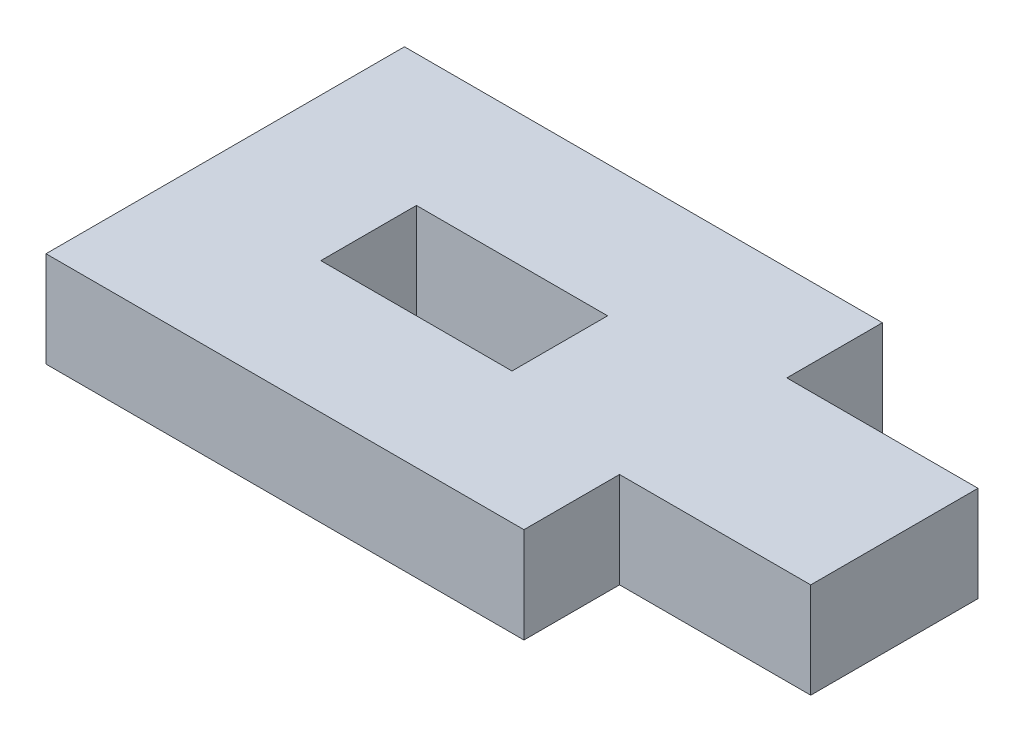
ISO-10303-21;
HEADER;
FILE_DESCRIPTION(('STEP AP214'),'2;1');
FILE_NAME('part.step','',(''),(''),'','','');
FILE_SCHEMA(('AUTOMOTIVE_DESIGN { 1 0 10303 214 1 1 1 1 }'));
ENDSEC;
DATA;
#1=APPLICATION_CONTEXT('core data for automotive mechanical design processes');
#2=APPLICATION_PROTOCOL_DEFINITION('international standard','automotive_design',2000,#1);
#3=PRODUCT_CONTEXT('',#1,'mechanical');
#4=PRODUCT('Part','Part','',(#3));
#5=PRODUCT_RELATED_PRODUCT_CATEGORY('part','',(#4));
#6=PRODUCT_DEFINITION_FORMATION('','',#4);
#7=PRODUCT_DEFINITION_CONTEXT('part definition',#1,'design');
#8=PRODUCT_DEFINITION('design','',#6,#7);
#9=PRODUCT_DEFINITION_SHAPE('','',#8);
#10=(LENGTH_UNIT() NAMED_UNIT(*) SI_UNIT(.MILLI.,.METRE.));
#11=(NAMED_UNIT(*) PLANE_ANGLE_UNIT() SI_UNIT($,.RADIAN.));
#12=(NAMED_UNIT(*) SI_UNIT($,.STERADIAN.) SOLID_ANGLE_UNIT());
#13=UNCERTAINTY_MEASURE_WITH_UNIT(LENGTH_MEASURE(1.E-05),#10,'distance_accuracy_value','');
#14=(GEOMETRIC_REPRESENTATION_CONTEXT(3) GLOBAL_UNCERTAINTY_ASSIGNED_CONTEXT((#13)) GLOBAL_UNIT_ASSIGNED_CONTEXT((#10,
#11,#12)) REPRESENTATION_CONTEXT('',''));
#15=CARTESIAN_POINT('',(0.,0.,0.));
#16=DIRECTION('',(0.,0.,1.));
#17=DIRECTION('',(1.,0.,0.));
#18=AXIS2_PLACEMENT_3D('',#15,#16,#17);
#19=CARTESIAN_POINT('',(10.,4.,-7.5));
#20=DIRECTION('',(-1.,0.,0.));
#21=DIRECTION('',(0.,0.,1.));
#22=AXIS2_PLACEMENT_3D('',#19,#20,#21);
#23=PLANE('',#22);
#24=DIRECTION('',(0.,-1.,0.));
#25=VECTOR('',#24,1.);
#26=CARTESIAN_POINT('',(10.,4.,3.5));
#27=LINE('',#26,#25);
#28=CARTESIAN_POINT('',(10.,4.,3.5));
#29=VERTEX_POINT('',#28);
#30=CARTESIAN_POINT('',(10.,0.,3.5));
#31=VERTEX_POINT('',#30);
#32=EDGE_CURVE('E127',#29,#31,#27,.T.);
#33=ORIENTED_EDGE('',*,*,#32,.F.);
#34=DIRECTION('',(0.,0.,-1.));
#35=VECTOR('',#34,1.);
#36=CARTESIAN_POINT('',(10.,4.,-7.5));
#37=LINE('',#36,#35);
#38=CARTESIAN_POINT('',(10.,4.,7.5));
#39=VERTEX_POINT('',#38);
#40=EDGE_CURVE('E139',#39,#29,#37,.T.);
#41=ORIENTED_EDGE('',*,*,#40,.F.);
#42=DIRECTION('',(0.,-1.,0.));
#43=VECTOR('',#42,1.);
#44=CARTESIAN_POINT('',(10.,4.,7.5));
#45=LINE('',#44,#43);
#46=CARTESIAN_POINT('',(10.,0.,7.5));
#47=VERTEX_POINT('',#46);
#48=EDGE_CURVE('E41',#39,#47,#45,.T.);
#49=ORIENTED_EDGE('',*,*,#48,.T.);
#50=DIRECTION('',(0.,0.,-1.));
#51=VECTOR('',#50,1.);
#52=CARTESIAN_POINT('',(10.,0.,-7.5));
#53=LINE('',#52,#51);
#54=EDGE_CURVE('E141',#47,#31,#53,.T.);
#55=ORIENTED_EDGE('',*,*,#54,.T.);
#56=EDGE_LOOP('',(#33,#41,#49,#55));
#57=FACE_BOUND('',#56,.T.);
#58=ADVANCED_FACE('F33',(#57),#23,.F.);
#59=CARTESIAN_POINT('',(0.,4.,0.));
#60=DIRECTION('',(0.,1.,0.));
#61=DIRECTION('',(0.,0.,1.));
#62=AXIS2_PLACEMENT_3D('',#59,#60,#61);
#63=PLANE('',#62);
#64=DIRECTION('',(0.,0.,1.));
#65=VECTOR('',#64,1.);
#66=CARTESIAN_POINT('',(-10.,4.,-7.5));
#67=LINE('',#66,#65);
#68=CARTESIAN_POINT('',(-10.,4.,-7.5));
#69=VERTEX_POINT('',#68);
#70=CARTESIAN_POINT('',(-10.,4.,7.5));
#71=VERTEX_POINT('',#70);
#72=EDGE_CURVE('E167',#69,#71,#67,.T.);
#73=ORIENTED_EDGE('',*,*,#72,.T.);
#74=DIRECTION('',(1.,0.,0.));
#75=VECTOR('',#74,1.);
#76=CARTESIAN_POINT('',(-10.,4.,7.5));
#77=LINE('',#76,#75);
#78=EDGE_CURVE('E147',#71,#39,#77,.T.);
#79=ORIENTED_EDGE('',*,*,#78,.T.);
#80=ORIENTED_EDGE('',*,*,#40,.T.);
#81=DIRECTION('',(1.,0.,0.));
#82=VECTOR('',#81,1.);
#83=CARTESIAN_POINT('',(18.,4.,3.5));
#84=LINE('',#83,#82);
#85=CARTESIAN_POINT('',(18.,4.,3.5));
#86=VERTEX_POINT('',#85);
#87=EDGE_CURVE('E124',#29,#86,#84,.T.);
#88=ORIENTED_EDGE('',*,*,#87,.T.);
#89=DIRECTION('',(0.,0.,-1.));
#90=VECTOR('',#89,1.);
#91=CARTESIAN_POINT('',(18.,4.,-3.5));
#92=LINE('',#91,#90);
#93=CARTESIAN_POINT('',(18.,4.,-3.5));
#94=VERTEX_POINT('',#93);
#95=EDGE_CURVE('E134',#86,#94,#92,.T.);
#96=ORIENTED_EDGE('',*,*,#95,.T.);
#97=DIRECTION('',(-1.,0.,0.));
#98=VECTOR('',#97,1.);
#99=CARTESIAN_POINT('',(10.,4.,-3.5));
#100=LINE('',#99,#98);
#101=CARTESIAN_POINT('',(10.,4.,-3.5));
#102=VERTEX_POINT('',#101);
#103=EDGE_CURVE('E183',#94,#102,#100,.T.);
#104=ORIENTED_EDGE('',*,*,#103,.T.);
#105=CARTESIAN_POINT('',(10.,4.,-7.5));
#106=VERTEX_POINT('',#105);
#107=EDGE_CURVE('E150',#102,#106,#37,.T.);
#108=ORIENTED_EDGE('',*,*,#107,.T.);
#109=DIRECTION('',(-1.,0.,0.));
#110=VECTOR('',#109,1.);
#111=CARTESIAN_POINT('',(-10.,4.,-7.5));
#112=LINE('',#111,#110);
#113=EDGE_CURVE('E149',#106,#69,#112,.T.);
#114=ORIENTED_EDGE('',*,*,#113,.T.);
#115=EDGE_LOOP('',(#73,#79,#80,#88,#96,#104,#108,#114));
#116=FACE_BOUND('',#115,.T.);
#117=DIRECTION('',(-1.,0.,0.));
#118=VECTOR('',#117,1.);
#119=CARTESIAN_POINT('',(4.,4.,-2.));
#120=LINE('',#119,#118);
#121=CARTESIAN_POINT('',(4.,4.,-2.));
#122=VERTEX_POINT('',#121);
#123=CARTESIAN_POINT('',(-4.,4.,-2.));
#124=VERTEX_POINT('',#123);
#125=EDGE_CURVE('E194',#122,#124,#120,.T.);
#126=ORIENTED_EDGE('',*,*,#125,.F.);
#127=DIRECTION('',(0.,0.,-1.));
#128=VECTOR('',#127,1.);
#129=CARTESIAN_POINT('',(4.,4.,2.));
#130=LINE('',#129,#128);
#131=CARTESIAN_POINT('',(4.,4.,2.));
#132=VERTEX_POINT('',#131);
#133=EDGE_CURVE('E192',#132,#122,#130,.T.);
#134=ORIENTED_EDGE('',*,*,#133,.F.);
#135=DIRECTION('',(1.,0.,0.));
#136=VECTOR('',#135,1.);
#137=CARTESIAN_POINT('',(4.,4.,2.));
#138=LINE('',#137,#136);
#139=CARTESIAN_POINT('',(-4.,4.,2.));
#140=VERTEX_POINT('',#139);
#141=EDGE_CURVE('E199',#140,#132,#138,.T.);
#142=ORIENTED_EDGE('',*,*,#141,.F.);
#143=DIRECTION('',(0.,0.,1.));
#144=VECTOR('',#143,1.);
#145=CARTESIAN_POINT('',(-4.,4.,2.));
#146=LINE('',#145,#144);
#147=EDGE_CURVE('E197',#124,#140,#146,.T.);
#148=ORIENTED_EDGE('',*,*,#147,.F.);
#149=EDGE_LOOP('',(#126,#134,#142,#148));
#150=FACE_BOUND('',#149,.T.);
#151=ADVANCED_FACE('F145',(#116,#150),#63,.T.);
#152=CARTESIAN_POINT('',(0.,0.,0.));
#153=DIRECTION('',(0.,1.,0.));
#154=DIRECTION('',(0.,0.,1.));
#155=AXIS2_PLACEMENT_3D('',#152,#153,#154);
#156=PLANE('',#155);
#157=DIRECTION('',(0.,0.,1.));
#158=VECTOR('',#157,1.);
#159=CARTESIAN_POINT('',(-10.,0.,-7.5));
#160=LINE('',#159,#158);
#161=CARTESIAN_POINT('',(-10.,0.,-7.5));
#162=VERTEX_POINT('',#161);
#163=CARTESIAN_POINT('',(-10.,0.,7.5));
#164=VERTEX_POINT('',#163);
#165=EDGE_CURVE('E157',#162,#164,#160,.T.);
#166=ORIENTED_EDGE('',*,*,#165,.F.);
#167=DIRECTION('',(-1.,0.,0.));
#168=VECTOR('',#167,1.);
#169=CARTESIAN_POINT('',(-10.,0.,-7.5));
#170=LINE('',#169,#168);
#171=CARTESIAN_POINT('',(10.,0.,-7.5));
#172=VERTEX_POINT('',#171);
#173=EDGE_CURVE('E165',#172,#162,#170,.T.);
#174=ORIENTED_EDGE('',*,*,#173,.F.);
#175=CARTESIAN_POINT('',(10.,0.,-3.5));
#176=VERTEX_POINT('',#175);
#177=EDGE_CURVE('E163',#176,#172,#53,.T.);
#178=ORIENTED_EDGE('',*,*,#177,.F.);
#179=DIRECTION('',(-1.,0.,0.));
#180=VECTOR('',#179,1.);
#181=CARTESIAN_POINT('',(10.,0.,-3.5));
#182=LINE('',#181,#180);
#183=CARTESIAN_POINT('',(18.,0.,-3.5));
#184=VERTEX_POINT('',#183);
#185=EDGE_CURVE('E48',#184,#176,#182,.T.);
#186=ORIENTED_EDGE('',*,*,#185,.F.);
#187=DIRECTION('',(0.,0.,-1.));
#188=VECTOR('',#187,1.);
#189=CARTESIAN_POINT('',(18.,0.,-3.5));
#190=LINE('',#189,#188);
#191=CARTESIAN_POINT('',(18.,0.,3.5));
#192=VERTEX_POINT('',#191);
#193=EDGE_CURVE('E179',#192,#184,#190,.T.);
#194=ORIENTED_EDGE('',*,*,#193,.F.);
#195=DIRECTION('',(1.,0.,0.));
#196=VECTOR('',#195,1.);
#197=CARTESIAN_POINT('',(18.,0.,3.5));
#198=LINE('',#197,#196);
#199=EDGE_CURVE('E178',#31,#192,#198,.T.);
#200=ORIENTED_EDGE('',*,*,#199,.F.);
#201=ORIENTED_EDGE('',*,*,#54,.F.);
#202=DIRECTION('',(1.,0.,0.));
#203=VECTOR('',#202,1.);
#204=CARTESIAN_POINT('',(-10.,0.,7.5));
#205=LINE('',#204,#203);
#206=EDGE_CURVE('E160',#164,#47,#205,.T.);
#207=ORIENTED_EDGE('',*,*,#206,.F.);
#208=EDGE_LOOP('',(#166,#174,#178,#186,#194,#200,#201,#207));
#209=FACE_BOUND('',#208,.T.);
#210=DIRECTION('',(0.,0.,-1.));
#211=VECTOR('',#210,1.);
#212=CARTESIAN_POINT('',(4.,0.,2.));
#213=LINE('',#212,#211);
#214=CARTESIAN_POINT('',(4.,0.,2.));
#215=VERTEX_POINT('',#214);
#216=CARTESIAN_POINT('',(4.,0.,-2.));
#217=VERTEX_POINT('',#216);
#218=EDGE_CURVE('E142',#215,#217,#213,.T.);
#219=ORIENTED_EDGE('',*,*,#218,.T.);
#220=DIRECTION('',(-1.,0.,0.));
#221=VECTOR('',#220,1.);
#222=CARTESIAN_POINT('',(4.,0.,-2.));
#223=LINE('',#222,#221);
#224=CARTESIAN_POINT('',(-4.,0.,-2.));
#225=VERTEX_POINT('',#224);
#226=EDGE_CURVE('E204',#217,#225,#223,.T.);
#227=ORIENTED_EDGE('',*,*,#226,.T.);
#228=DIRECTION('',(0.,0.,1.));
#229=VECTOR('',#228,1.);
#230=CARTESIAN_POINT('',(-4.,0.,2.));
#231=LINE('',#230,#229);
#232=CARTESIAN_POINT('',(-4.,0.,2.));
#233=VERTEX_POINT('',#232);
#234=EDGE_CURVE('E207',#225,#233,#231,.T.);
#235=ORIENTED_EDGE('',*,*,#234,.T.);
#236=DIRECTION('',(1.,0.,0.));
#237=VECTOR('',#236,1.);
#238=CARTESIAN_POINT('',(4.,0.,2.));
#239=LINE('',#238,#237);
#240=EDGE_CURVE('E195',#233,#215,#239,.T.);
#241=ORIENTED_EDGE('',*,*,#240,.T.);
#242=EDGE_LOOP('',(#219,#227,#235,#241));
#243=FACE_BOUND('',#242,.T.);
#244=ADVANCED_FACE('F175',(#209,#243),#156,.F.);
#245=CARTESIAN_POINT('',(-10.,4.,-7.5));
#246=DIRECTION('',(1.,0.,0.));
#247=DIRECTION('',(0.,0.,-1.));
#248=AXIS2_PLACEMENT_3D('',#245,#246,#247);
#249=PLANE('',#248);
#250=ORIENTED_EDGE('',*,*,#165,.T.);
#251=DIRECTION('',(0.,-1.,0.));
#252=VECTOR('',#251,1.);
#253=CARTESIAN_POINT('',(-10.,4.,7.5));
#254=LINE('',#253,#252);
#255=EDGE_CURVE('E11',#71,#164,#254,.T.);
#256=ORIENTED_EDGE('',*,*,#255,.F.);
#257=ORIENTED_EDGE('',*,*,#72,.F.);
#258=DIRECTION('',(0.,-1.,0.));
#259=VECTOR('',#258,1.);
#260=CARTESIAN_POINT('',(-10.,4.,-7.5));
#261=LINE('',#260,#259);
#262=EDGE_CURVE('E152',#69,#162,#261,.T.);
#263=ORIENTED_EDGE('',*,*,#262,.T.);
#264=EDGE_LOOP('',(#250,#256,#257,#263));
#265=FACE_BOUND('',#264,.T.);
#266=ADVANCED_FACE('F35',(#265),#249,.F.);
#267=CARTESIAN_POINT('',(-10.,4.,7.5));
#268=DIRECTION('',(0.,0.,-1.));
#269=DIRECTION('',(-1.,0.,0.));
#270=AXIS2_PLACEMENT_3D('',#267,#268,#269);
#271=PLANE('',#270);
#272=ORIENTED_EDGE('',*,*,#206,.T.);
#273=ORIENTED_EDGE('',*,*,#48,.F.);
#274=ORIENTED_EDGE('',*,*,#78,.F.);
#275=ORIENTED_EDGE('',*,*,#255,.T.);
#276=EDGE_LOOP('',(#272,#273,#274,#275));
#277=FACE_BOUND('',#276,.T.);
#278=ADVANCED_FACE('F223',(#277),#271,.F.);
#279=ORIENTED_EDGE('',*,*,#107,.F.);
#280=DIRECTION('',(0.,-1.,0.));
#281=VECTOR('',#280,1.);
#282=CARTESIAN_POINT('',(10.,4.,-3.5));
#283=LINE('',#282,#281);
#284=EDGE_CURVE('E187',#102,#176,#283,.T.);
#285=ORIENTED_EDGE('',*,*,#284,.T.);
#286=ORIENTED_EDGE('',*,*,#177,.T.);
#287=DIRECTION('',(0.,-1.,0.));
#288=VECTOR('',#287,1.);
#289=CARTESIAN_POINT('',(10.,4.,-7.5));
#290=LINE('',#289,#288);
#291=EDGE_CURVE('E170',#106,#172,#290,.T.);
#292=ORIENTED_EDGE('',*,*,#291,.F.);
#293=EDGE_LOOP('',(#279,#285,#286,#292));
#294=FACE_BOUND('',#293,.T.);
#295=ADVANCED_FACE('F225',(#294),#23,.F.);
#296=CARTESIAN_POINT('',(-10.,4.,-7.5));
#297=DIRECTION('',(0.,0.,1.));
#298=DIRECTION('',(1.,0.,0.));
#299=AXIS2_PLACEMENT_3D('',#296,#297,#298);
#300=PLANE('',#299);
#301=ORIENTED_EDGE('',*,*,#173,.T.);
#302=ORIENTED_EDGE('',*,*,#262,.F.);
#303=ORIENTED_EDGE('',*,*,#113,.F.);
#304=ORIENTED_EDGE('',*,*,#291,.T.);
#305=EDGE_LOOP('',(#301,#302,#303,#304));
#306=FACE_BOUND('',#305,.T.);
#307=ADVANCED_FACE('F230',(#306),#300,.F.);
#308=CARTESIAN_POINT('',(4.,4.,2.));
#309=DIRECTION('',(-1.,0.,0.));
#310=DIRECTION('',(0.,0.,1.));
#311=AXIS2_PLACEMENT_3D('',#308,#309,#310);
#312=PLANE('',#311);
#313=ORIENTED_EDGE('',*,*,#218,.F.);
#314=DIRECTION('',(0.,-1.,0.));
#315=VECTOR('',#314,1.);
#316=CARTESIAN_POINT('',(4.,4.,2.));
#317=LINE('',#316,#315);
#318=EDGE_CURVE('E201',#132,#215,#317,.T.);
#319=ORIENTED_EDGE('',*,*,#318,.F.);
#320=ORIENTED_EDGE('',*,*,#133,.T.);
#321=DIRECTION('',(0.,-1.,0.));
#322=VECTOR('',#321,1.);
#323=CARTESIAN_POINT('',(4.,4.,-2.));
#324=LINE('',#323,#322);
#325=EDGE_CURVE('E161',#122,#217,#324,.T.);
#326=ORIENTED_EDGE('',*,*,#325,.T.);
#327=EDGE_LOOP('',(#313,#319,#320,#326));
#328=FACE_BOUND('',#327,.T.);
#329=ADVANCED_FACE('F241',(#328),#312,.T.);
#330=CARTESIAN_POINT('',(4.,4.,-2.));
#331=DIRECTION('',(0.,0.,1.));
#332=DIRECTION('',(1.,0.,0.));
#333=AXIS2_PLACEMENT_3D('',#330,#331,#332);
#334=PLANE('',#333);
#335=ORIENTED_EDGE('',*,*,#226,.F.);
#336=ORIENTED_EDGE('',*,*,#325,.F.);
#337=ORIENTED_EDGE('',*,*,#125,.T.);
#338=DIRECTION('',(0.,-1.,0.));
#339=VECTOR('',#338,1.);
#340=CARTESIAN_POINT('',(-4.,4.,-2.));
#341=LINE('',#340,#339);
#342=EDGE_CURVE('E215',#124,#225,#341,.T.);
#343=ORIENTED_EDGE('',*,*,#342,.T.);
#344=EDGE_LOOP('',(#335,#336,#337,#343));
#345=FACE_BOUND('',#344,.T.);
#346=ADVANCED_FACE('F247',(#345),#334,.T.);
#347=CARTESIAN_POINT('',(-4.,4.,2.));
#348=DIRECTION('',(1.,0.,0.));
#349=DIRECTION('',(0.,0.,-1.));
#350=AXIS2_PLACEMENT_3D('',#347,#348,#349);
#351=PLANE('',#350);
#352=ORIENTED_EDGE('',*,*,#234,.F.);
#353=ORIENTED_EDGE('',*,*,#342,.F.);
#354=ORIENTED_EDGE('',*,*,#147,.T.);
#355=DIRECTION('',(0.,-1.,0.));
#356=VECTOR('',#355,1.);
#357=CARTESIAN_POINT('',(-4.,4.,2.));
#358=LINE('',#357,#356);
#359=EDGE_CURVE('E56',#140,#233,#358,.T.);
#360=ORIENTED_EDGE('',*,*,#359,.T.);
#361=EDGE_LOOP('',(#352,#353,#354,#360));
#362=FACE_BOUND('',#361,.T.);
#363=ADVANCED_FACE('F251',(#362),#351,.T.);
#364=CARTESIAN_POINT('',(4.,4.,2.));
#365=DIRECTION('',(0.,0.,-1.));
#366=DIRECTION('',(-1.,0.,0.));
#367=AXIS2_PLACEMENT_3D('',#364,#365,#366);
#368=PLANE('',#367);
#369=ORIENTED_EDGE('',*,*,#240,.F.);
#370=ORIENTED_EDGE('',*,*,#359,.F.);
#371=ORIENTED_EDGE('',*,*,#141,.T.);
#372=ORIENTED_EDGE('',*,*,#318,.T.);
#373=EDGE_LOOP('',(#369,#370,#371,#372));
#374=FACE_BOUND('',#373,.T.);
#375=ADVANCED_FACE('F255',(#374),#368,.T.);
#376=CARTESIAN_POINT('',(18.,4.,3.5));
#377=DIRECTION('',(0.,0.,-1.));
#378=DIRECTION('',(-1.,0.,0.));
#379=AXIS2_PLACEMENT_3D('',#376,#377,#378);
#380=PLANE('',#379);
#381=ORIENTED_EDGE('',*,*,#199,.T.);
#382=DIRECTION('',(0.,-1.,0.));
#383=VECTOR('',#382,1.);
#384=CARTESIAN_POINT('',(18.,4.,3.5));
#385=LINE('',#384,#383);
#386=EDGE_CURVE('E130',#86,#192,#385,.T.);
#387=ORIENTED_EDGE('',*,*,#386,.F.);
#388=ORIENTED_EDGE('',*,*,#87,.F.);
#389=ORIENTED_EDGE('',*,*,#32,.T.);
#390=EDGE_LOOP('',(#381,#387,#388,#389));
#391=FACE_BOUND('',#390,.T.);
#392=ADVANCED_FACE('F126',(#391),#380,.F.);
#393=CARTESIAN_POINT('',(18.,4.,-3.5));
#394=DIRECTION('',(-1.,0.,0.));
#395=DIRECTION('',(0.,0.,1.));
#396=AXIS2_PLACEMENT_3D('',#393,#394,#395);
#397=PLANE('',#396);
#398=ORIENTED_EDGE('',*,*,#193,.T.);
#399=DIRECTION('',(0.,-1.,0.));
#400=VECTOR('',#399,1.);
#401=CARTESIAN_POINT('',(18.,4.,-3.5));
#402=LINE('',#401,#400);
#403=EDGE_CURVE('E189',#94,#184,#402,.T.);
#404=ORIENTED_EDGE('',*,*,#403,.F.);
#405=ORIENTED_EDGE('',*,*,#95,.F.);
#406=ORIENTED_EDGE('',*,*,#386,.T.);
#407=EDGE_LOOP('',(#398,#404,#405,#406));
#408=FACE_BOUND('',#407,.T.);
#409=ADVANCED_FACE('F261',(#408),#397,.F.);
#410=CARTESIAN_POINT('',(10.,4.,-3.5));
#411=DIRECTION('',(0.,0.,1.));
#412=DIRECTION('',(1.,0.,0.));
#413=AXIS2_PLACEMENT_3D('',#410,#411,#412);
#414=PLANE('',#413);
#415=ORIENTED_EDGE('',*,*,#185,.T.);
#416=ORIENTED_EDGE('',*,*,#284,.F.);
#417=ORIENTED_EDGE('',*,*,#103,.F.);
#418=ORIENTED_EDGE('',*,*,#403,.T.);
#419=EDGE_LOOP('',(#415,#416,#417,#418));
#420=FACE_BOUND('',#419,.T.);
#421=ADVANCED_FACE('F264',(#420),#414,.F.);
#422=CLOSED_SHELL('',(#58,#151,#244,#266,#278,#295,#307,#329,#346,#363,#375,#392,#409,#421));
#423=MANIFOLD_SOLID_BREP('B2',#422);
#424=ADVANCED_BREP_SHAPE_REPRESENTATION('',(#18,#423),#14);
#425=SHAPE_DEFINITION_REPRESENTATION(#9,#424);
ENDSEC;
END-ISO-10303-21;
